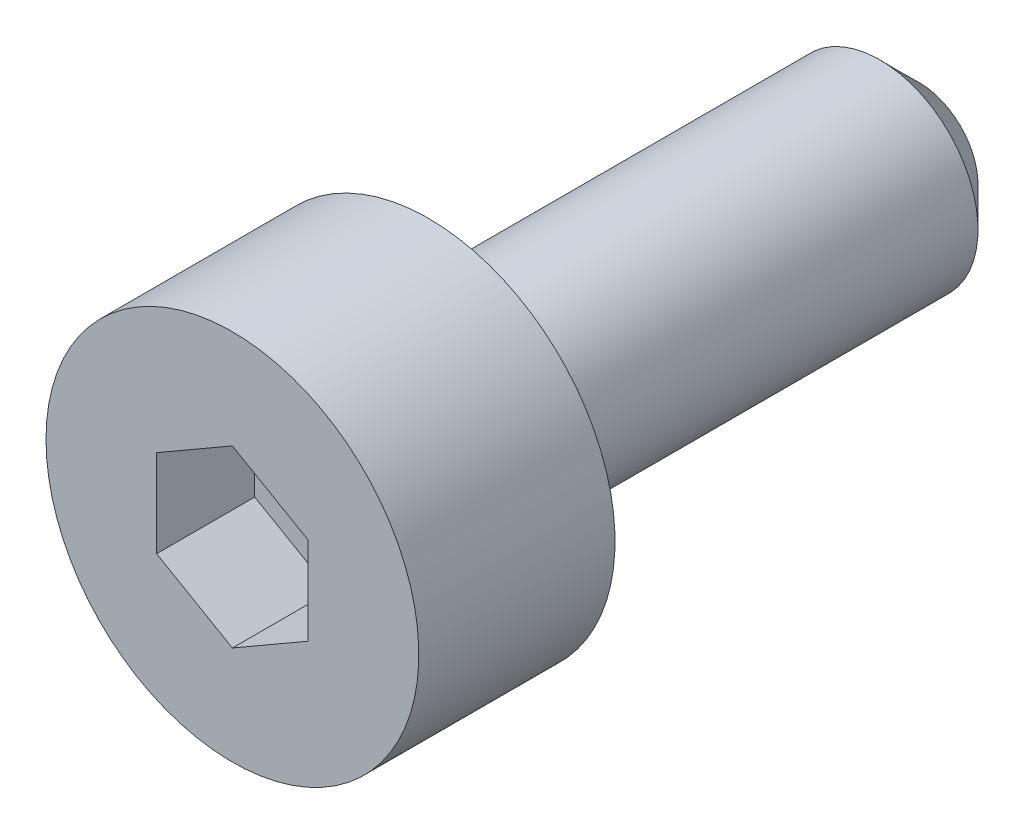
ISO-10303-21;
HEADER;
FILE_DESCRIPTION(('STEP AP214'),'2;1');
FILE_NAME('part.step','',(''),(''),'','','');
FILE_SCHEMA(('AUTOMOTIVE_DESIGN { 1 0 10303 214 1 1 1 1 }'));
ENDSEC;
DATA;
#1=APPLICATION_CONTEXT('core data for automotive mechanical design processes');
#2=APPLICATION_PROTOCOL_DEFINITION('international standard','automotive_design',2000,#1);
#3=PRODUCT_CONTEXT('',#1,'mechanical');
#4=PRODUCT('Part','Part','',(#3));
#5=PRODUCT_RELATED_PRODUCT_CATEGORY('part','',(#4));
#6=PRODUCT_DEFINITION_FORMATION('','',#4);
#7=PRODUCT_DEFINITION_CONTEXT('part definition',#1,'design');
#8=PRODUCT_DEFINITION('design','',#6,#7);
#9=PRODUCT_DEFINITION_SHAPE('','',#8);
#10=(LENGTH_UNIT() NAMED_UNIT(*) SI_UNIT(.MILLI.,.METRE.));
#11=(NAMED_UNIT(*) PLANE_ANGLE_UNIT() SI_UNIT($,.RADIAN.));
#12=(NAMED_UNIT(*) SI_UNIT($,.STERADIAN.) SOLID_ANGLE_UNIT());
#13=UNCERTAINTY_MEASURE_WITH_UNIT(LENGTH_MEASURE(1.E-05),#10,'distance_accuracy_value','');
#14=(GEOMETRIC_REPRESENTATION_CONTEXT(3) GLOBAL_UNCERTAINTY_ASSIGNED_CONTEXT((#13)) GLOBAL_UNIT_ASSIGNED_CONTEXT((#10,
#11,#12)) REPRESENTATION_CONTEXT('',''));
#15=CARTESIAN_POINT('',(0.,0.,0.));
#16=DIRECTION('',(0.,0.,1.));
#17=DIRECTION('',(1.,0.,0.));
#18=AXIS2_PLACEMENT_3D('',#15,#16,#17);
#19=CARTESIAN_POINT('',(0.,0.,0.));
#20=DIRECTION('',(0.,0.,-1.));
#21=DIRECTION('',(-1.,0.,0.));
#22=AXIS2_PLACEMENT_3D('',#19,#20,#21);
#23=PLANE('',#22);
#24=CARTESIAN_POINT('',(0.,0.,0.));
#25=DIRECTION('',(0.,0.,-1.));
#26=DIRECTION('',(-1.,0.,0.));
#27=AXIS2_PLACEMENT_3D('',#24,#25,#26);
#28=CIRCLE('',#27,1.9);
#29=CARTESIAN_POINT('',(-1.9,0.,0.));
#30=VERTEX_POINT('',#29);
#31=EDGE_CURVE('E126',#30,#30,#28,.T.);
#32=ORIENTED_EDGE('',*,*,#31,.T.);
#33=EDGE_LOOP('',(#32));
#34=FACE_BOUND('',#33,.T.);
#35=CARTESIAN_POINT('',(0.,0.,0.));
#36=DIRECTION('',(0.,0.,-1.));
#37=DIRECTION('',(-1.,0.,0.));
#38=AXIS2_PLACEMENT_3D('',#35,#36,#37);
#39=CIRCLE('',#38,1.);
#40=CARTESIAN_POINT('',(-1.,0.,0.));
#41=VERTEX_POINT('',#40);
#42=EDGE_CURVE('E118',#41,#41,#39,.T.);
#43=ORIENTED_EDGE('',*,*,#42,.F.);
#44=EDGE_LOOP('',(#43));
#45=FACE_BOUND('',#44,.T.);
#46=ADVANCED_FACE('F16',(#34,#45),#23,.T.);
#47=CARTESIAN_POINT('',(0.,0.,2.));
#48=DIRECTION('',(0.,0.,-1.));
#49=DIRECTION('',(-1.,0.,0.));
#50=AXIS2_PLACEMENT_3D('',#47,#48,#49);
#51=CYLINDRICAL_SURFACE('',#50,1.9);
#52=CARTESIAN_POINT('',(0.,0.,2.));
#53=DIRECTION('',(0.,0.,-1.));
#54=DIRECTION('',(-1.,0.,0.));
#55=AXIS2_PLACEMENT_3D('',#52,#53,#54);
#56=CIRCLE('',#55,1.9);
#57=CARTESIAN_POINT('',(-1.9,0.,2.));
#58=VERTEX_POINT('',#57);
#59=EDGE_CURVE('E127',#58,#58,#56,.T.);
#60=ORIENTED_EDGE('',*,*,#59,.T.);
#61=EDGE_LOOP('',(#60));
#62=FACE_BOUND('',#61,.T.);
#63=ORIENTED_EDGE('',*,*,#31,.F.);
#64=EDGE_LOOP('',(#63));
#65=FACE_BOUND('',#64,.T.);
#66=ADVANCED_FACE('F151',(#62,#65),#51,.T.);
#67=CARTESIAN_POINT('',(0.,0.,2.));
#68=DIRECTION('',(0.,0.,-1.));
#69=DIRECTION('',(-1.,0.,0.));
#70=AXIS2_PLACEMENT_3D('',#67,#68,#69);
#71=PLANE('',#70);
#72=DIRECTION('',(-0.866025403784439,-0.5,0.));
#73=VECTOR('',#72,1.);
#74=CARTESIAN_POINT('',(0.,0.892006165897972,2.));
#75=LINE('',#74,#73);
#76=CARTESIAN_POINT('',(0.,0.892006165897972,2.));
#77=VERTEX_POINT('',#76);
#78=CARTESIAN_POINT('',(-0.7725,0.446003082948986,2.));
#79=VERTEX_POINT('',#78);
#80=EDGE_CURVE('E105',#77,#79,#75,.T.);
#81=ORIENTED_EDGE('',*,*,#80,.F.);
#82=DIRECTION('',(-0.866025403784439,0.5,0.));
#83=VECTOR('',#82,1.);
#84=CARTESIAN_POINT('',(0.7725,0.446003082948988,2.));
#85=LINE('',#84,#83);
#86=CARTESIAN_POINT('',(0.7725,0.446003082948988,2.));
#87=VERTEX_POINT('',#86);
#88=EDGE_CURVE('E31',#87,#77,#85,.T.);
#89=ORIENTED_EDGE('',*,*,#88,.F.);
#90=DIRECTION('',(0.,1.,0.));
#91=VECTOR('',#90,1.);
#92=CARTESIAN_POINT('',(0.7725,-0.446003082948986,2.));
#93=LINE('',#92,#91);
#94=CARTESIAN_POINT('',(0.7725,-0.446003082948986,2.));
#95=VERTEX_POINT('',#94);
#96=EDGE_CURVE('E114',#95,#87,#93,.T.);
#97=ORIENTED_EDGE('',*,*,#96,.F.);
#98=DIRECTION('',(0.866025403784439,0.5,0.));
#99=VECTOR('',#98,1.);
#100=CARTESIAN_POINT('',(0.,-0.892006165897973,2.));
#101=LINE('',#100,#99);
#102=CARTESIAN_POINT('',(0.,-0.892006165897973,2.));
#103=VERTEX_POINT('',#102);
#104=EDGE_CURVE('E112',#103,#95,#101,.T.);
#105=ORIENTED_EDGE('',*,*,#104,.F.);
#106=DIRECTION('',(0.866025403784439,-0.5,0.));
#107=VECTOR('',#106,1.);
#108=CARTESIAN_POINT('',(-0.7725,-0.446003082948985,2.));
#109=LINE('',#108,#107);
#110=CARTESIAN_POINT('',(-0.7725,-0.446003082948985,2.));
#111=VERTEX_POINT('',#110);
#112=EDGE_CURVE('E79',#111,#103,#109,.T.);
#113=ORIENTED_EDGE('',*,*,#112,.F.);
#114=DIRECTION('',(0.,-1.,0.));
#115=VECTOR('',#114,1.);
#116=CARTESIAN_POINT('',(-0.7725,0.446003082948986,2.));
#117=LINE('',#116,#115);
#118=EDGE_CURVE('E108',#79,#111,#117,.T.);
#119=ORIENTED_EDGE('',*,*,#118,.F.);
#120=EDGE_LOOP('',(#81,#89,#97,#105,#113,#119));
#121=FACE_BOUND('',#120,.T.);
#122=ORIENTED_EDGE('',*,*,#59,.F.);
#123=EDGE_LOOP('',(#122));
#124=FACE_BOUND('',#123,.T.);
#125=ADVANCED_FACE('F158',(#121,#124),#71,.F.);
#126=CARTESIAN_POINT('',(0.,0.,-5.));
#127=DIRECTION('',(0.,0.,1.));
#128=DIRECTION('',(1.,0.,0.));
#129=AXIS2_PLACEMENT_3D('',#126,#127,#128);
#130=CYLINDRICAL_SURFACE('',#129,1.);
#131=CARTESIAN_POINT('',(0.,0.,-4.6));
#132=DIRECTION('',(0.,0.,-1.));
#133=DIRECTION('',(-1.,0.,0.));
#134=AXIS2_PLACEMENT_3D('',#131,#132,#133);
#135=CIRCLE('',#134,1.);
#136=CARTESIAN_POINT('',(-1.,0.,-4.6));
#137=VERTEX_POINT('',#136);
#138=EDGE_CURVE('E11',#137,#137,#135,.F.);
#139=ORIENTED_EDGE('',*,*,#138,.T.);
#140=EDGE_LOOP('',(#139));
#141=FACE_BOUND('',#140,.T.);
#142=ORIENTED_EDGE('',*,*,#42,.T.);
#143=EDGE_LOOP('',(#142));
#144=FACE_BOUND('',#143,.T.);
#145=ADVANCED_FACE('F147',(#141,#144),#130,.T.);
#146=CARTESIAN_POINT('',(0.,0.,-5.));
#147=DIRECTION('',(0.,0.,-1.));
#148=DIRECTION('',(-1.,0.,0.));
#149=AXIS2_PLACEMENT_3D('',#146,#147,#148);
#150=PLANE('',#149);
#151=CARTESIAN_POINT('',(0.,0.,-5.));
#152=DIRECTION('',(0.,0.,-1.));
#153=DIRECTION('',(-1.,0.,0.));
#154=AXIS2_PLACEMENT_3D('',#151,#152,#153);
#155=CIRCLE('',#154,0.6);
#156=CARTESIAN_POINT('',(-0.6,0.,-5.));
#157=VERTEX_POINT('',#156);
#158=EDGE_CURVE('E24',#157,#157,#155,.T.);
#159=ORIENTED_EDGE('',*,*,#158,.T.);
#160=EDGE_LOOP('',(#159));
#161=FACE_BOUND('',#160,.T.);
#162=ADVANCED_FACE('F134',(#161),#150,.T.);
#163=CARTESIAN_POINT('',(0.,0.,-5.));
#164=DIRECTION('',(0.,0.,1.));
#165=DIRECTION('',(1.,0.,0.));
#166=AXIS2_PLACEMENT_3D('',#163,#164,#165);
#167=CONICAL_SURFACE('',#166,0.6,0.785398163397446);
#168=ORIENTED_EDGE('',*,*,#138,.F.);
#169=EDGE_LOOP('',(#168));
#170=FACE_BOUND('',#169,.T.);
#171=ORIENTED_EDGE('',*,*,#158,.F.);
#172=EDGE_LOOP('',(#171));
#173=FACE_BOUND('',#172,.T.);
#174=ADVANCED_FACE('F18',(#170,#173),#167,.T.);
#175=CARTESIAN_POINT('',(0.7725,0.446003082948988,1.));
#176=DIRECTION('',(0.5,0.866025403784439,0.));
#177=DIRECTION('',(0.866025403784439,-0.5,0.));
#178=AXIS2_PLACEMENT_3D('',#175,#176,#177);
#179=PLANE('',#178);
#180=ORIENTED_EDGE('',*,*,#88,.T.);
#181=DIRECTION('',(0.,0.,1.));
#182=VECTOR('',#181,1.);
#183=CARTESIAN_POINT('',(0.,0.892006165897972,1.));
#184=LINE('',#183,#182);
#185=CARTESIAN_POINT('',(0.,0.892006165897972,1.));
#186=VERTEX_POINT('',#185);
#187=EDGE_CURVE('E61',#186,#77,#184,.T.);
#188=ORIENTED_EDGE('',*,*,#187,.F.);
#189=DIRECTION('',(-0.866025403784439,0.5,0.));
#190=VECTOR('',#189,1.);
#191=CARTESIAN_POINT('',(0.7725,0.446003082948988,1.));
#192=LINE('',#191,#190);
#193=CARTESIAN_POINT('',(0.7725,0.446003082948988,1.));
#194=VERTEX_POINT('',#193);
#195=EDGE_CURVE('E116',#194,#186,#192,.T.);
#196=ORIENTED_EDGE('',*,*,#195,.F.);
#197=DIRECTION('',(0.,0.,1.));
#198=VECTOR('',#197,1.);
#199=CARTESIAN_POINT('',(0.7725,0.446003082948988,1.));
#200=LINE('',#199,#198);
#201=EDGE_CURVE('E39',#194,#87,#200,.T.);
#202=ORIENTED_EDGE('',*,*,#201,.T.);
#203=EDGE_LOOP('',(#180,#188,#196,#202));
#204=FACE_BOUND('',#203,.T.);
#205=ADVANCED_FACE('F137',(#204),#179,.F.);
#206=CARTESIAN_POINT('',(0.7725,-0.446003082948986,1.));
#207=DIRECTION('',(1.,0.,0.));
#208=DIRECTION('',(0.,-1.,0.));
#209=AXIS2_PLACEMENT_3D('',#206,#207,#208);
#210=PLANE('',#209);
#211=ORIENTED_EDGE('',*,*,#96,.T.);
#212=ORIENTED_EDGE('',*,*,#201,.F.);
#213=DIRECTION('',(0.,1.,0.));
#214=VECTOR('',#213,1.);
#215=CARTESIAN_POINT('',(0.7725,-0.446003082948986,1.));
#216=LINE('',#215,#214);
#217=CARTESIAN_POINT('',(0.7725,-0.446003082948986,1.));
#218=VERTEX_POINT('',#217);
#219=EDGE_CURVE('E91',#218,#194,#216,.T.);
#220=ORIENTED_EDGE('',*,*,#219,.F.);
#221=DIRECTION('',(0.,0.,1.));
#222=VECTOR('',#221,1.);
#223=CARTESIAN_POINT('',(0.7725,-0.446003082948986,1.));
#224=LINE('',#223,#222);
#225=EDGE_CURVE('E83',#218,#95,#224,.T.);
#226=ORIENTED_EDGE('',*,*,#225,.T.);
#227=EDGE_LOOP('',(#211,#212,#220,#226));
#228=FACE_BOUND('',#227,.T.);
#229=ADVANCED_FACE('F145',(#228),#210,.F.);
#230=CARTESIAN_POINT('',(0.,-0.892006165897973,1.));
#231=DIRECTION('',(0.5,-0.866025403784439,0.));
#232=DIRECTION('',(-0.866025403784439,-0.5,0.));
#233=AXIS2_PLACEMENT_3D('',#230,#231,#232);
#234=PLANE('',#233);
#235=ORIENTED_EDGE('',*,*,#104,.T.);
#236=ORIENTED_EDGE('',*,*,#225,.F.);
#237=DIRECTION('',(0.866025403784439,0.5,0.));
#238=VECTOR('',#237,1.);
#239=CARTESIAN_POINT('',(0.,-0.892006165897973,1.));
#240=LINE('',#239,#238);
#241=CARTESIAN_POINT('',(0.,-0.892006165897973,1.));
#242=VERTEX_POINT('',#241);
#243=EDGE_CURVE('E87',#242,#218,#240,.T.);
#244=ORIENTED_EDGE('',*,*,#243,.F.);
#245=DIRECTION('',(0.,0.,1.));
#246=VECTOR('',#245,1.);
#247=CARTESIAN_POINT('',(0.,-0.892006165897973,1.));
#248=LINE('',#247,#246);
#249=EDGE_CURVE('E72',#242,#103,#248,.T.);
#250=ORIENTED_EDGE('',*,*,#249,.T.);
#251=EDGE_LOOP('',(#235,#236,#244,#250));
#252=FACE_BOUND('',#251,.T.);
#253=ADVANCED_FACE('F88',(#252),#234,.F.);
#254=CARTESIAN_POINT('',(-0.7725,-0.446003082948985,1.));
#255=DIRECTION('',(-0.5,-0.866025403784439,0.));
#256=DIRECTION('',(-0.866025403784439,0.5,0.));
#257=AXIS2_PLACEMENT_3D('',#254,#255,#256);
#258=PLANE('',#257);
#259=ORIENTED_EDGE('',*,*,#112,.T.);
#260=ORIENTED_EDGE('',*,*,#249,.F.);
#261=DIRECTION('',(0.866025403784439,-0.5,0.));
#262=VECTOR('',#261,1.);
#263=CARTESIAN_POINT('',(-0.7725,-0.446003082948985,1.));
#264=LINE('',#263,#262);
#265=CARTESIAN_POINT('',(-0.7725,-0.446003082948985,1.));
#266=VERTEX_POINT('',#265);
#267=EDGE_CURVE('E76',#266,#242,#264,.T.);
#268=ORIENTED_EDGE('',*,*,#267,.F.);
#269=DIRECTION('',(0.,0.,1.));
#270=VECTOR('',#269,1.);
#271=CARTESIAN_POINT('',(-0.7725,-0.446003082948985,1.));
#272=LINE('',#271,#270);
#273=EDGE_CURVE('E84',#266,#111,#272,.T.);
#274=ORIENTED_EDGE('',*,*,#273,.T.);
#275=EDGE_LOOP('',(#259,#260,#268,#274));
#276=FACE_BOUND('',#275,.T.);
#277=ADVANCED_FACE('F74',(#276),#258,.F.);
#278=CARTESIAN_POINT('',(-0.7725,0.446003082948986,1.));
#279=DIRECTION('',(-1.,0.,0.));
#280=DIRECTION('',(0.,1.,0.));
#281=AXIS2_PLACEMENT_3D('',#278,#279,#280);
#282=PLANE('',#281);
#283=ORIENTED_EDGE('',*,*,#118,.T.);
#284=ORIENTED_EDGE('',*,*,#273,.F.);
#285=DIRECTION('',(0.,-1.,0.));
#286=VECTOR('',#285,1.);
#287=CARTESIAN_POINT('',(-0.7725,0.446003082948986,1.));
#288=LINE('',#287,#286);
#289=CARTESIAN_POINT('',(-0.7725,0.446003082948986,1.));
#290=VERTEX_POINT('',#289);
#291=EDGE_CURVE('E97',#290,#266,#288,.T.);
#292=ORIENTED_EDGE('',*,*,#291,.F.);
#293=DIRECTION('',(0.,0.,1.));
#294=VECTOR('',#293,1.);
#295=CARTESIAN_POINT('',(-0.7725,0.446003082948986,1.));
#296=LINE('',#295,#294);
#297=EDGE_CURVE('E121',#290,#79,#296,.T.);
#298=ORIENTED_EDGE('',*,*,#297,.T.);
#299=EDGE_LOOP('',(#283,#284,#292,#298));
#300=FACE_BOUND('',#299,.T.);
#301=ADVANCED_FACE('F171',(#300),#282,.F.);
#302=CARTESIAN_POINT('',(0.,0.892006165897972,1.));
#303=DIRECTION('',(-0.5,0.866025403784439,0.));
#304=DIRECTION('',(0.866025403784439,0.5,0.));
#305=AXIS2_PLACEMENT_3D('',#302,#303,#304);
#306=PLANE('',#305);
#307=ORIENTED_EDGE('',*,*,#80,.T.);
#308=ORIENTED_EDGE('',*,*,#297,.F.);
#309=DIRECTION('',(-0.866025403784439,-0.5,0.));
#310=VECTOR('',#309,1.);
#311=CARTESIAN_POINT('',(0.,0.892006165897972,1.));
#312=LINE('',#311,#310);
#313=EDGE_CURVE('E99',#186,#290,#312,.T.);
#314=ORIENTED_EDGE('',*,*,#313,.F.);
#315=ORIENTED_EDGE('',*,*,#187,.T.);
#316=EDGE_LOOP('',(#307,#308,#314,#315));
#317=FACE_BOUND('',#316,.T.);
#318=ADVANCED_FACE('F168',(#317),#306,.F.);
#319=CARTESIAN_POINT('',(0.,0.892006165897972,1.));
#320=DIRECTION('',(0.,0.,1.));
#321=DIRECTION('',(1.,0.,0.));
#322=AXIS2_PLACEMENT_3D('',#319,#320,#321);
#323=PLANE('',#322);
#324=ORIENTED_EDGE('',*,*,#195,.T.);
#325=ORIENTED_EDGE('',*,*,#313,.T.);
#326=ORIENTED_EDGE('',*,*,#291,.T.);
#327=ORIENTED_EDGE('',*,*,#267,.T.);
#328=ORIENTED_EDGE('',*,*,#243,.T.);
#329=ORIENTED_EDGE('',*,*,#219,.T.);
#330=EDGE_LOOP('',(#324,#325,#326,#327,#328,#329));
#331=FACE_BOUND('',#330,.T.);
#332=ADVANCED_FACE('F94',(#331),#323,.T.);
#333=CLOSED_SHELL('',(#46,#66,#125,#145,#162,#174,#205,#229,#253,#277,#301,#318,#332));
#334=MANIFOLD_SOLID_BREP('B1',#333);
#335=ADVANCED_BREP_SHAPE_REPRESENTATION('',(#18,#334),#14);
#336=SHAPE_DEFINITION_REPRESENTATION(#9,#335);
ENDSEC;
END-ISO-10303-21;
